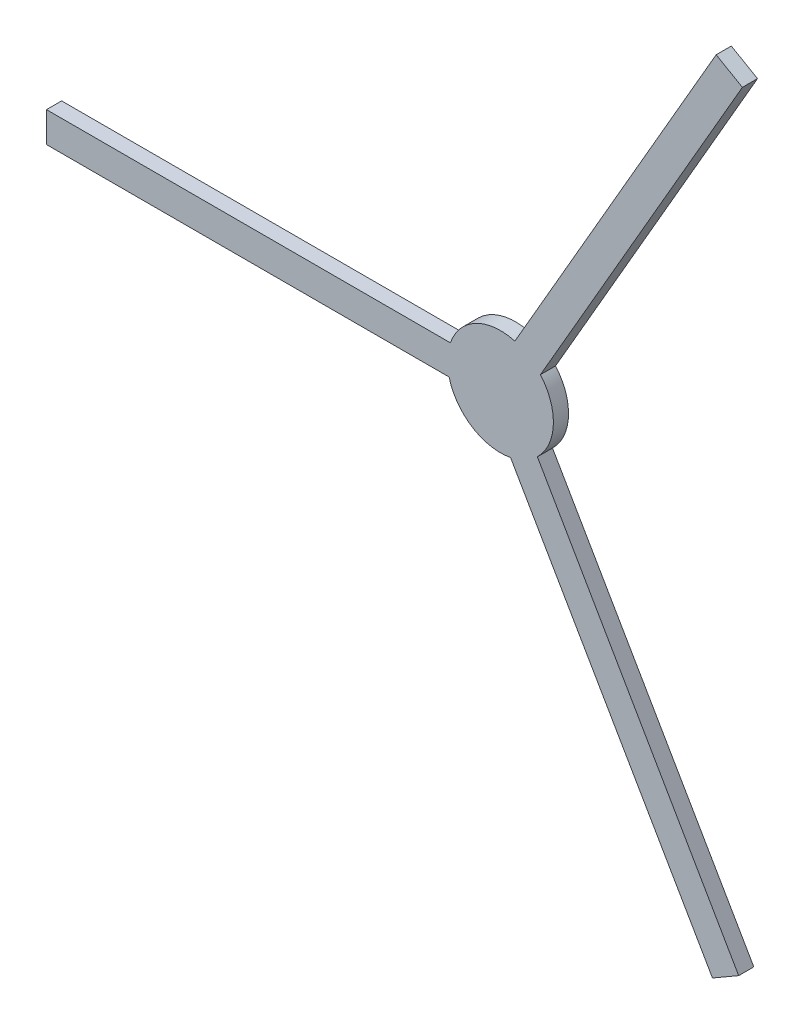
ISO-10303-21;
HEADER;
FILE_DESCRIPTION(('STEP AP214'),'2;1');
FILE_NAME('part.step','',(''),(''),'','','');
FILE_SCHEMA(('AUTOMOTIVE_DESIGN { 1 0 10303 214 1 1 1 1 }'));
ENDSEC;
DATA;
#1=APPLICATION_CONTEXT('core data for automotive mechanical design processes');
#2=APPLICATION_PROTOCOL_DEFINITION('international standard','automotive_design',2000,#1);
#3=PRODUCT_CONTEXT('',#1,'mechanical');
#4=PRODUCT('Part','Part','',(#3));
#5=PRODUCT_RELATED_PRODUCT_CATEGORY('part','',(#4));
#6=PRODUCT_DEFINITION_FORMATION('','',#4);
#7=PRODUCT_DEFINITION_CONTEXT('part definition',#1,'design');
#8=PRODUCT_DEFINITION('design','',#6,#7);
#9=PRODUCT_DEFINITION_SHAPE('','',#8);
#10=(LENGTH_UNIT() NAMED_UNIT(*) SI_UNIT(.MILLI.,.METRE.));
#11=(NAMED_UNIT(*) PLANE_ANGLE_UNIT() SI_UNIT($,.RADIAN.));
#12=(NAMED_UNIT(*) SI_UNIT($,.STERADIAN.) SOLID_ANGLE_UNIT());
#13=UNCERTAINTY_MEASURE_WITH_UNIT(LENGTH_MEASURE(1.E-05),#10,'distance_accuracy_value','');
#14=(GEOMETRIC_REPRESENTATION_CONTEXT(3) GLOBAL_UNCERTAINTY_ASSIGNED_CONTEXT((#13)) GLOBAL_UNIT_ASSIGNED_CONTEXT((#10,
#11,#12)) REPRESENTATION_CONTEXT('',''));
#15=CARTESIAN_POINT('',(0.,0.,0.));
#16=DIRECTION('',(0.,0.,1.));
#17=DIRECTION('',(1.,0.,0.));
#18=AXIS2_PLACEMENT_3D('',#15,#16,#17);
#19=CARTESIAN_POINT('',(0.,0.,10.));
#20=DIRECTION('',(0.,0.,-1.));
#21=DIRECTION('',(-1.,0.,0.));
#22=AXIS2_PLACEMENT_3D('',#19,#20,#21);
#23=CYLINDRICAL_SURFACE('',#22,35.);
#24=CARTESIAN_POINT('',(0.,0.,0.));
#25=DIRECTION('',(0.,0.,1.));
#26=DIRECTION('',(1.,0.,0.));
#27=AXIS2_PLACEMENT_3D('',#24,#25,#26);
#28=CIRCLE('',#27,35.);
#29=CARTESIAN_POINT('',(9.52818873681015,33.6780881196621,0.));
#30=VERTEX_POINT('',#29);
#31=CARTESIAN_POINT('',(-33.0870419622069,11.4126094382993,0.));
#32=VERTEX_POINT('',#31);
#33=EDGE_CURVE('E156',#30,#32,#28,.T.);
#34=ORIENTED_EDGE('',*,*,#33,.T.);
#35=DIRECTION('',(0.,0.,-1.));
#36=VECTOR('',#35,1.);
#37=CARTESIAN_POINT('',(-33.0870419622069,11.4126094382993,10.));
#38=LINE('',#37,#36);
#39=CARTESIAN_POINT('',(-33.0870419622069,11.4126094382993,10.));
#40=VERTEX_POINT('',#39);
#41=EDGE_CURVE('E11',#40,#32,#38,.T.);
#42=ORIENTED_EDGE('',*,*,#41,.F.);
#43=CARTESIAN_POINT('',(0.,0.,10.));
#44=DIRECTION('',(0.,0.,1.));
#45=DIRECTION('',(1.,0.,0.));
#46=AXIS2_PLACEMENT_3D('',#43,#44,#45);
#47=CIRCLE('',#46,35.);
#48=CARTESIAN_POINT('',(9.52818873681015,33.6780881196621,10.));
#49=VERTEX_POINT('',#48);
#50=EDGE_CURVE('E178',#49,#40,#47,.T.);
#51=ORIENTED_EDGE('',*,*,#50,.F.);
#52=DIRECTION('',(0.,0.,-1.));
#53=VECTOR('',#52,1.);
#54=CARTESIAN_POINT('',(9.52818873681015,33.6780881196621,10.));
#55=LINE('',#54,#53);
#56=EDGE_CURVE('E152',#49,#30,#55,.T.);
#57=ORIENTED_EDGE('',*,*,#56,.T.);
#58=EDGE_LOOP('',(#34,#42,#51,#57));
#59=FACE_BOUND('',#58,.T.);
#60=ADVANCED_FACE('F36',(#59),#23,.T.);
#61=CARTESIAN_POINT('',(-33.0870419622069,11.4126094382993,10.));
#62=DIRECTION('',(0.,-1.,0.));
#63=DIRECTION('',(1.,0.,0.));
#64=AXIS2_PLACEMENT_3D('',#61,#62,#63);
#65=PLANE('',#64);
#66=DIRECTION('',(-1.,0.,0.));
#67=VECTOR('',#66,1.);
#68=CARTESIAN_POINT('',(-33.0870419622069,11.4126094382993,0.));
#69=LINE('',#68,#67);
#70=CARTESIAN_POINT('',(-300.,11.4126094382993,0.));
#71=VERTEX_POINT('',#70);
#72=EDGE_CURVE('E159',#32,#71,#69,.T.);
#73=ORIENTED_EDGE('',*,*,#72,.T.);
#74=DIRECTION('',(0.,0.,-1.));
#75=VECTOR('',#74,1.);
#76=CARTESIAN_POINT('',(-300.,11.4126094382993,10.));
#77=LINE('',#76,#75);
#78=CARTESIAN_POINT('',(-300.,11.4126094382993,10.));
#79=VERTEX_POINT('',#78);
#80=EDGE_CURVE('E44',#79,#71,#77,.T.);
#81=ORIENTED_EDGE('',*,*,#80,.F.);
#82=DIRECTION('',(-1.,0.,0.));
#83=VECTOR('',#82,1.);
#84=CARTESIAN_POINT('',(-33.0870419622069,11.4126094382993,10.));
#85=LINE('',#84,#83);
#86=EDGE_CURVE('E107',#40,#79,#85,.T.);
#87=ORIENTED_EDGE('',*,*,#86,.F.);
#88=ORIENTED_EDGE('',*,*,#41,.T.);
#89=EDGE_LOOP('',(#73,#81,#87,#88));
#90=FACE_BOUND('',#89,.T.);
#91=ADVANCED_FACE('F256',(#90),#65,.F.);
#92=CARTESIAN_POINT('',(-300.,11.4126094382993,10.));
#93=DIRECTION('',(1.,0.,0.));
#94=DIRECTION('',(0.,1.,0.));
#95=AXIS2_PLACEMENT_3D('',#92,#93,#94);
#96=PLANE('',#95);
#97=DIRECTION('',(0.,-1.,0.));
#98=VECTOR('',#97,1.);
#99=CARTESIAN_POINT('',(-300.,11.4126094382993,0.));
#100=LINE('',#99,#98);
#101=CARTESIAN_POINT('',(-300.,-8.58739056170072,0.));
#102=VERTEX_POINT('',#101);
#103=EDGE_CURVE('E161',#71,#102,#100,.T.);
#104=ORIENTED_EDGE('',*,*,#103,.T.);
#105=DIRECTION('',(0.,0.,-1.));
#106=VECTOR('',#105,1.);
#107=CARTESIAN_POINT('',(-300.,-8.58739056170072,10.));
#108=LINE('',#107,#106);
#109=CARTESIAN_POINT('',(-300.,-8.58739056170072,10.));
#110=VERTEX_POINT('',#109);
#111=EDGE_CURVE('E197',#110,#102,#108,.T.);
#112=ORIENTED_EDGE('',*,*,#111,.F.);
#113=DIRECTION('',(0.,-1.,0.));
#114=VECTOR('',#113,1.);
#115=CARTESIAN_POINT('',(-300.,11.4126094382993,10.));
#116=LINE('',#115,#114);
#117=EDGE_CURVE('E205',#79,#110,#116,.T.);
#118=ORIENTED_EDGE('',*,*,#117,.F.);
#119=ORIENTED_EDGE('',*,*,#80,.T.);
#120=EDGE_LOOP('',(#104,#112,#118,#119));
#121=FACE_BOUND('',#120,.T.);
#122=ADVANCED_FACE('F203',(#121),#96,.F.);
#123=CARTESIAN_POINT('',(-33.9301742309233,-8.58739056170069,10.));
#124=DIRECTION('',(0.,1.,0.));
#125=DIRECTION('',(-1.,0.,0.));
#126=AXIS2_PLACEMENT_3D('',#123,#124,#125);
#127=PLANE('',#126);
#128=DIRECTION('',(1.,0.,0.));
#129=VECTOR('',#128,1.);
#130=CARTESIAN_POINT('',(-33.9301742309233,-8.58739056170069,0.));
#131=LINE('',#130,#129);
#132=CARTESIAN_POINT('',(-33.9301742309233,-8.58739056170069,0.));
#133=VERTEX_POINT('',#132);
#134=EDGE_CURVE('E163',#102,#133,#131,.T.);
#135=ORIENTED_EDGE('',*,*,#134,.T.);
#136=DIRECTION('',(0.,0.,-1.));
#137=VECTOR('',#136,1.);
#138=CARTESIAN_POINT('',(-33.9301742309233,-8.58739056170069,10.));
#139=LINE('',#138,#137);
#140=CARTESIAN_POINT('',(-33.9301742309233,-8.58739056170069,10.));
#141=VERTEX_POINT('',#140);
#142=EDGE_CURVE('E194',#141,#133,#139,.T.);
#143=ORIENTED_EDGE('',*,*,#142,.F.);
#144=DIRECTION('',(1.,0.,0.));
#145=VECTOR('',#144,1.);
#146=CARTESIAN_POINT('',(-33.9301742309233,-8.58739056170069,10.));
#147=LINE('',#146,#145);
#148=EDGE_CURVE('E223',#110,#141,#147,.T.);
#149=ORIENTED_EDGE('',*,*,#148,.F.);
#150=ORIENTED_EDGE('',*,*,#111,.T.);
#151=EDGE_LOOP('',(#135,#143,#149,#150));
#152=FACE_BOUND('',#151,.T.);
#153=ADVANCED_FACE('F214',(#152),#127,.F.);
#154=CARTESIAN_POINT('',(0.,0.,10.));
#155=DIRECTION('',(0.,0.,-1.));
#156=DIRECTION('',(-1.,0.,0.));
#157=AXIS2_PLACEMENT_3D('',#154,#155,#156);
#158=CYLINDRICAL_SURFACE('',#157,35.);
#159=CARTESIAN_POINT('',(0.,0.,0.));
#160=DIRECTION('',(0.,0.,1.));
#161=DIRECTION('',(1.,0.,0.));
#162=AXIS2_PLACEMENT_3D('',#159,#160,#161);
#163=CIRCLE('',#162,35.);
#164=CARTESIAN_POINT('',(6.65991128406621,-34.3605235945026,0.));
#165=VERTEX_POINT('',#164);
#166=EDGE_CURVE('E165',#133,#165,#163,.T.);
#167=ORIENTED_EDGE('',*,*,#166,.T.);
#168=DIRECTION('',(0.,0.,-1.));
#169=VECTOR('',#168,1.);
#170=CARTESIAN_POINT('',(6.65991128406621,-34.3605235945026,10.));
#171=LINE('',#170,#169);
#172=CARTESIAN_POINT('',(6.65991128406621,-34.3605235945026,10.));
#173=VERTEX_POINT('',#172);
#174=EDGE_CURVE('E191',#173,#165,#171,.T.);
#175=ORIENTED_EDGE('',*,*,#174,.F.);
#176=CARTESIAN_POINT('',(0.,0.,10.));
#177=DIRECTION('',(0.,0.,1.));
#178=DIRECTION('',(1.,0.,0.));
#179=AXIS2_PLACEMENT_3D('',#176,#177,#178);
#180=CIRCLE('',#179,35.);
#181=EDGE_CURVE('E220',#141,#173,#180,.T.);
#182=ORIENTED_EDGE('',*,*,#181,.F.);
#183=ORIENTED_EDGE('',*,*,#142,.T.);
#184=EDGE_LOOP('',(#167,#175,#182,#183));
#185=FACE_BOUND('',#184,.T.);
#186=ADVANCED_FACE('F218',(#185),#158,.T.);
#187=CARTESIAN_POINT('',(6.65991128406622,-34.3605235945026,10.));
#188=DIRECTION('',(0.866025403784438,0.500000000000001,0.));
#189=DIRECTION('',(-0.500000000000001,0.866025403784438,0.));
#190=AXIS2_PLACEMENT_3D('',#187,#188,#189);
#191=PLANE('',#190);
#192=DIRECTION('',(0.500000000000001,-0.866025403784438,0.));
#193=VECTOR('',#192,1.);
#194=CARTESIAN_POINT('',(6.65991128406622,-34.3605235945026,0.));
#195=LINE('',#194,#193);
#196=CARTESIAN_POINT('',(140.116390302963,-265.513925854481,0.));
#197=VERTEX_POINT('',#196);
#198=EDGE_CURVE('E167',#165,#197,#195,.T.);
#199=ORIENTED_EDGE('',*,*,#198,.T.);
#200=DIRECTION('',(0.,0.,-1.));
#201=VECTOR('',#200,1.);
#202=CARTESIAN_POINT('',(140.116390302963,-265.513925854481,10.));
#203=LINE('',#202,#201);
#204=CARTESIAN_POINT('',(140.116390302963,-265.513925854481,10.));
#205=VERTEX_POINT('',#204);
#206=EDGE_CURVE('E188',#205,#197,#203,.T.);
#207=ORIENTED_EDGE('',*,*,#206,.F.);
#208=DIRECTION('',(0.500000000000001,-0.866025403784438,0.));
#209=VECTOR('',#208,1.);
#210=CARTESIAN_POINT('',(6.65991128406622,-34.3605235945026,10.));
#211=LINE('',#210,#209);
#212=EDGE_CURVE('E222',#173,#205,#211,.T.);
#213=ORIENTED_EDGE('',*,*,#212,.F.);
#214=ORIENTED_EDGE('',*,*,#174,.T.);
#215=EDGE_LOOP('',(#199,#207,#213,#214));
#216=FACE_BOUND('',#215,.T.);
#217=ADVANCED_FACE('F269',(#216),#191,.F.);
#218=CARTESIAN_POINT('',(140.116390302963,-265.513925854481,10.));
#219=DIRECTION('',(-0.499999999999998,0.86602540378444,0.));
#220=DIRECTION('',(-0.86602540378444,-0.499999999999998,0.));
#221=AXIS2_PLACEMENT_3D('',#218,#219,#220);
#222=PLANE('',#221);
#223=DIRECTION('',(0.86602540378444,0.499999999999998,0.));
#224=VECTOR('',#223,1.);
#225=CARTESIAN_POINT('',(140.116390302963,-265.513925854481,0.));
#226=LINE('',#225,#224);
#227=CARTESIAN_POINT('',(157.436898378652,-255.513925854481,0.));
#228=VERTEX_POINT('',#227);
#229=EDGE_CURVE('E169',#197,#228,#226,.T.);
#230=ORIENTED_EDGE('',*,*,#229,.T.);
#231=DIRECTION('',(0.,0.,-1.));
#232=VECTOR('',#231,1.);
#233=CARTESIAN_POINT('',(157.436898378652,-255.513925854481,10.));
#234=LINE('',#233,#232);
#235=CARTESIAN_POINT('',(157.436898378652,-255.513925854481,10.));
#236=VERTEX_POINT('',#235);
#237=EDGE_CURVE('E185',#236,#228,#234,.T.);
#238=ORIENTED_EDGE('',*,*,#237,.F.);
#239=DIRECTION('',(0.86602540378444,0.499999999999998,0.));
#240=VECTOR('',#239,1.);
#241=CARTESIAN_POINT('',(140.116390302963,-265.513925854481,10.));
#242=LINE('',#241,#240);
#243=EDGE_CURVE('E225',#205,#236,#242,.T.);
#244=ORIENTED_EDGE('',*,*,#243,.F.);
#245=ORIENTED_EDGE('',*,*,#206,.T.);
#246=EDGE_LOOP('',(#230,#238,#244,#245));
#247=FACE_BOUND('',#246,.T.);
#248=ADVANCED_FACE('F272',(#247),#222,.F.);
#249=CARTESIAN_POINT('',(24.4019854941132,-25.0906975579614,10.));
#250=DIRECTION('',(-0.866025403784438,-0.500000000000001,0.));
#251=DIRECTION('',(0.500000000000001,-0.866025403784438,0.));
#252=AXIS2_PLACEMENT_3D('',#249,#250,#251);
#253=PLANE('',#252);
#254=DIRECTION('',(-0.500000000000001,0.866025403784438,0.));
#255=VECTOR('',#254,1.);
#256=CARTESIAN_POINT('',(24.4019854941132,-25.0906975579614,0.));
#257=LINE('',#256,#255);
#258=CARTESIAN_POINT('',(24.4019854941132,-25.0906975579614,0.));
#259=VERTEX_POINT('',#258);
#260=EDGE_CURVE('E171',#228,#259,#257,.T.);
#261=ORIENTED_EDGE('',*,*,#260,.T.);
#262=DIRECTION('',(0.,0.,-1.));
#263=VECTOR('',#262,1.);
#264=CARTESIAN_POINT('',(24.4019854941132,-25.0906975579614,10.));
#265=LINE('',#264,#263);
#266=CARTESIAN_POINT('',(24.4019854941132,-25.0906975579614,10.));
#267=VERTEX_POINT('',#266);
#268=EDGE_CURVE('E182',#267,#259,#265,.T.);
#269=ORIENTED_EDGE('',*,*,#268,.F.);
#270=DIRECTION('',(-0.500000000000001,0.866025403784438,0.));
#271=VECTOR('',#270,1.);
#272=CARTESIAN_POINT('',(24.4019854941132,-25.0906975579614,10.));
#273=LINE('',#272,#271);
#274=EDGE_CURVE('E231',#236,#267,#273,.T.);
#275=ORIENTED_EDGE('',*,*,#274,.F.);
#276=ORIENTED_EDGE('',*,*,#237,.T.);
#277=EDGE_LOOP('',(#261,#269,#275,#276));
#278=FACE_BOUND('',#277,.T.);
#279=ADVANCED_FACE('F237',(#278),#253,.F.);
#280=CARTESIAN_POINT('',(0.,0.,10.));
#281=DIRECTION('',(0.,0.,-1.));
#282=DIRECTION('',(-1.,0.,0.));
#283=AXIS2_PLACEMENT_3D('',#280,#281,#282);
#284=CYLINDRICAL_SURFACE('',#283,35.);
#285=CARTESIAN_POINT('',(0.,0.,0.));
#286=DIRECTION('',(0.,0.,1.));
#287=DIRECTION('',(1.,0.,0.));
#288=AXIS2_PLACEMENT_3D('',#285,#286,#287);
#289=CIRCLE('',#288,35.);
#290=CARTESIAN_POINT('',(26.4271306781407,22.9479141562033,0.));
#291=VERTEX_POINT('',#290);
#292=EDGE_CURVE('E173',#259,#291,#289,.T.);
#293=ORIENTED_EDGE('',*,*,#292,.T.);
#294=DIRECTION('',(0.,0.,-1.));
#295=VECTOR('',#294,1.);
#296=CARTESIAN_POINT('',(26.4271306781407,22.9479141562033,10.));
#297=LINE('',#296,#295);
#298=CARTESIAN_POINT('',(26.4271306781407,22.9479141562033,10.));
#299=VERTEX_POINT('',#298);
#300=EDGE_CURVE('E147',#299,#291,#297,.T.);
#301=ORIENTED_EDGE('',*,*,#300,.F.);
#302=CARTESIAN_POINT('',(0.,0.,10.));
#303=DIRECTION('',(0.,0.,1.));
#304=DIRECTION('',(1.,0.,0.));
#305=AXIS2_PLACEMENT_3D('',#302,#303,#304);
#306=CIRCLE('',#305,35.);
#307=EDGE_CURVE('E138',#267,#299,#306,.T.);
#308=ORIENTED_EDGE('',*,*,#307,.F.);
#309=ORIENTED_EDGE('',*,*,#268,.T.);
#310=EDGE_LOOP('',(#293,#301,#308,#309));
#311=FACE_BOUND('',#310,.T.);
#312=ADVANCED_FACE('F241',(#311),#284,.T.);
#313=CARTESIAN_POINT('',(26.4271306781407,22.9479141562033,10.));
#314=DIRECTION('',(-0.866025403784439,0.5,0.));
#315=DIRECTION('',(-0.5,-0.866025403784439,0.));
#316=AXIS2_PLACEMENT_3D('',#313,#314,#315);
#317=PLANE('',#316);
#318=DIRECTION('',(0.5,0.866025403784439,0.));
#319=VECTOR('',#318,1.);
#320=CARTESIAN_POINT('',(26.4271306781407,22.9479141562033,0.));
#321=LINE('',#320,#319);
#322=CARTESIAN_POINT('',(159.883609697037,254.101316416182,0.));
#323=VERTEX_POINT('',#322);
#324=EDGE_CURVE('E146',#291,#323,#321,.T.);
#325=ORIENTED_EDGE('',*,*,#324,.T.);
#326=DIRECTION('',(0.,0.,-1.));
#327=VECTOR('',#326,1.);
#328=CARTESIAN_POINT('',(159.883609697037,254.101316416182,10.));
#329=LINE('',#328,#327);
#330=CARTESIAN_POINT('',(159.883609697037,254.101316416182,10.));
#331=VERTEX_POINT('',#330);
#332=EDGE_CURVE('E143',#331,#323,#329,.T.);
#333=ORIENTED_EDGE('',*,*,#332,.F.);
#334=DIRECTION('',(0.5,0.866025403784439,0.));
#335=VECTOR('',#334,1.);
#336=CARTESIAN_POINT('',(26.4271306781407,22.9479141562033,10.));
#337=LINE('',#336,#335);
#338=EDGE_CURVE('E132',#299,#331,#337,.T.);
#339=ORIENTED_EDGE('',*,*,#338,.F.);
#340=ORIENTED_EDGE('',*,*,#300,.T.);
#341=EDGE_LOOP('',(#325,#333,#339,#340));
#342=FACE_BOUND('',#341,.T.);
#343=ADVANCED_FACE('F144',(#342),#317,.F.);
#344=CARTESIAN_POINT('',(159.883609697037,254.101316416182,10.));
#345=DIRECTION('',(-0.5,-0.866025403784438,0.));
#346=DIRECTION('',(0.866025403784438,-0.5,0.));
#347=AXIS2_PLACEMENT_3D('',#344,#345,#346);
#348=PLANE('',#347);
#349=DIRECTION('',(-0.866025403784438,0.5,0.));
#350=VECTOR('',#349,1.);
#351=CARTESIAN_POINT('',(159.883609697037,254.101316416182,0.));
#352=LINE('',#351,#350);
#353=CARTESIAN_POINT('',(142.563101621348,264.101316416182,0.));
#354=VERTEX_POINT('',#353);
#355=EDGE_CURVE('E93',#323,#354,#352,.T.);
#356=ORIENTED_EDGE('',*,*,#355,.T.);
#357=DIRECTION('',(0.,0.,-1.));
#358=VECTOR('',#357,1.);
#359=CARTESIAN_POINT('',(142.563101621348,264.101316416182,10.));
#360=LINE('',#359,#358);
#361=CARTESIAN_POINT('',(142.563101621348,264.101316416182,10.));
#362=VERTEX_POINT('',#361);
#363=EDGE_CURVE('E148',#362,#354,#360,.T.);
#364=ORIENTED_EDGE('',*,*,#363,.F.);
#365=DIRECTION('',(-0.866025403784438,0.5,0.));
#366=VECTOR('',#365,1.);
#367=CARTESIAN_POINT('',(159.883609697037,254.101316416182,10.));
#368=LINE('',#367,#366);
#369=EDGE_CURVE('E136',#331,#362,#368,.T.);
#370=ORIENTED_EDGE('',*,*,#369,.F.);
#371=ORIENTED_EDGE('',*,*,#332,.T.);
#372=EDGE_LOOP('',(#356,#364,#370,#371));
#373=FACE_BOUND('',#372,.T.);
#374=ADVANCED_FACE('F150',(#373),#348,.F.);
#375=CARTESIAN_POINT('',(9.52818873681015,33.6780881196621,10.));
#376=DIRECTION('',(0.866025403784439,-0.5,0.));
#377=DIRECTION('',(0.5,0.866025403784439,0.));
#378=AXIS2_PLACEMENT_3D('',#375,#376,#377);
#379=PLANE('',#378);
#380=DIRECTION('',(-0.5,-0.866025403784439,0.));
#381=VECTOR('',#380,1.);
#382=CARTESIAN_POINT('',(9.52818873681015,33.6780881196621,0.));
#383=LINE('',#382,#381);
#384=EDGE_CURVE('E99',#354,#30,#383,.T.);
#385=ORIENTED_EDGE('',*,*,#384,.T.);
#386=ORIENTED_EDGE('',*,*,#56,.F.);
#387=DIRECTION('',(-0.5,-0.866025403784439,0.));
#388=VECTOR('',#387,1.);
#389=CARTESIAN_POINT('',(9.52818873681015,33.6780881196621,10.));
#390=LINE('',#389,#388);
#391=EDGE_CURVE('E52',#362,#49,#390,.T.);
#392=ORIENTED_EDGE('',*,*,#391,.F.);
#393=ORIENTED_EDGE('',*,*,#363,.T.);
#394=EDGE_LOOP('',(#385,#386,#392,#393));
#395=FACE_BOUND('',#394,.T.);
#396=ADVANCED_FACE('F245',(#395),#379,.F.);
#397=CARTESIAN_POINT('',(0.,0.,10.));
#398=DIRECTION('',(0.,0.,1.));
#399=DIRECTION('',(1.,0.,0.));
#400=AXIS2_PLACEMENT_3D('',#397,#398,#399);
#401=PLANE('',#400);
#402=ORIENTED_EDGE('',*,*,#50,.T.);
#403=ORIENTED_EDGE('',*,*,#86,.T.);
#404=ORIENTED_EDGE('',*,*,#117,.T.);
#405=ORIENTED_EDGE('',*,*,#148,.T.);
#406=ORIENTED_EDGE('',*,*,#181,.T.);
#407=ORIENTED_EDGE('',*,*,#212,.T.);
#408=ORIENTED_EDGE('',*,*,#243,.T.);
#409=ORIENTED_EDGE('',*,*,#274,.T.);
#410=ORIENTED_EDGE('',*,*,#307,.T.);
#411=ORIENTED_EDGE('',*,*,#338,.T.);
#412=ORIENTED_EDGE('',*,*,#369,.T.);
#413=ORIENTED_EDGE('',*,*,#391,.T.);
#414=EDGE_LOOP('',(#402,#403,#404,#405,#406,#407,#408,#409,#410,#411,#412,#413));
#415=FACE_BOUND('',#414,.T.);
#416=ADVANCED_FACE('F134',(#415),#401,.T.);
#417=CARTESIAN_POINT('',(0.,0.,0.));
#418=DIRECTION('',(0.,0.,1.));
#419=DIRECTION('',(1.,0.,0.));
#420=AXIS2_PLACEMENT_3D('',#417,#418,#419);
#421=PLANE('',#420);
#422=ORIENTED_EDGE('',*,*,#33,.F.);
#423=ORIENTED_EDGE('',*,*,#384,.F.);
#424=ORIENTED_EDGE('',*,*,#355,.F.);
#425=ORIENTED_EDGE('',*,*,#324,.F.);
#426=ORIENTED_EDGE('',*,*,#292,.F.);
#427=ORIENTED_EDGE('',*,*,#260,.F.);
#428=ORIENTED_EDGE('',*,*,#229,.F.);
#429=ORIENTED_EDGE('',*,*,#198,.F.);
#430=ORIENTED_EDGE('',*,*,#166,.F.);
#431=ORIENTED_EDGE('',*,*,#134,.F.);
#432=ORIENTED_EDGE('',*,*,#103,.F.);
#433=ORIENTED_EDGE('',*,*,#72,.F.);
#434=EDGE_LOOP('',(#422,#423,#424,#425,#426,#427,#428,#429,#430,#431,#432,#433));
#435=FACE_BOUND('',#434,.T.);
#436=ADVANCED_FACE('F209',(#435),#421,.F.);
#437=CLOSED_SHELL('',(#60,#91,#122,#153,#186,#217,#248,#279,#312,#343,#374,#396,#416,#436));
#438=MANIFOLD_SOLID_BREP('B2',#437);
#439=ADVANCED_BREP_SHAPE_REPRESENTATION('',(#18,#438),#14);
#440=SHAPE_DEFINITION_REPRESENTATION(#9,#439);
ENDSEC;
END-ISO-10303-21;
